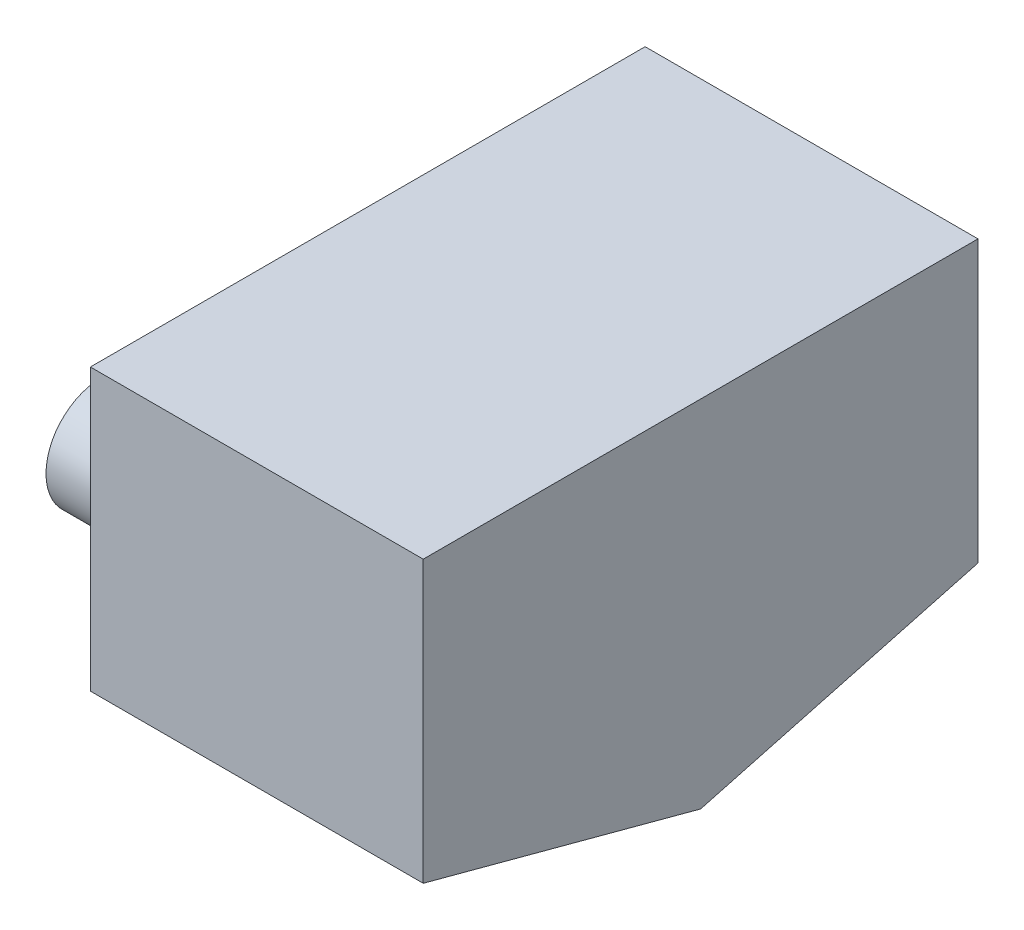
ISO-10303-21;
HEADER;
FILE_DESCRIPTION(('STEP AP214'),'2;1');
FILE_NAME('part.step','',(''),(''),'','','');
FILE_SCHEMA(('AUTOMOTIVE_DESIGN { 1 0 10303 214 1 1 1 1 }'));
ENDSEC;
DATA;
#1=APPLICATION_CONTEXT('core data for automotive mechanical design processes');
#2=APPLICATION_PROTOCOL_DEFINITION('international standard','automotive_design',2000,#1);
#3=PRODUCT_CONTEXT('',#1,'mechanical');
#4=PRODUCT('Part','Part','',(#3));
#5=PRODUCT_RELATED_PRODUCT_CATEGORY('part','',(#4));
#6=PRODUCT_DEFINITION_FORMATION('','',#4);
#7=PRODUCT_DEFINITION_CONTEXT('part definition',#1,'design');
#8=PRODUCT_DEFINITION('design','',#6,#7);
#9=PRODUCT_DEFINITION_SHAPE('','',#8);
#10=(LENGTH_UNIT() NAMED_UNIT(*) SI_UNIT(.MILLI.,.METRE.));
#11=(NAMED_UNIT(*) PLANE_ANGLE_UNIT() SI_UNIT($,.RADIAN.));
#12=(NAMED_UNIT(*) SI_UNIT($,.STERADIAN.) SOLID_ANGLE_UNIT());
#13=UNCERTAINTY_MEASURE_WITH_UNIT(LENGTH_MEASURE(1.E-05),#10,'distance_accuracy_value','');
#14=(GEOMETRIC_REPRESENTATION_CONTEXT(3) GLOBAL_UNCERTAINTY_ASSIGNED_CONTEXT((#13)) GLOBAL_UNIT_ASSIGNED_CONTEXT((#10,
#11,#12)) REPRESENTATION_CONTEXT('',''));
#15=CARTESIAN_POINT('',(0.,0.,0.));
#16=DIRECTION('',(0.,0.,1.));
#17=DIRECTION('',(1.,0.,0.));
#18=AXIS2_PLACEMENT_3D('',#15,#16,#17);
#19=CARTESIAN_POINT('',(0.,16.,25.));
#20=DIRECTION('',(1.,0.,0.));
#21=DIRECTION('',(0.,1.,0.));
#22=AXIS2_PLACEMENT_3D('',#19,#20,#21);
#23=PLANE('',#22);
#24=CARTESIAN_POINT('',(0.,7.83786374141146,5.5));
#25=DIRECTION('',(1.,0.,0.));
#26=DIRECTION('',(0.,1.,0.));
#27=AXIS2_PLACEMENT_3D('',#24,#25,#26);
#28=CIRCLE('',#27,2.5);
#29=CARTESIAN_POINT('',(0.,10.3378637414115,5.5));
#30=VERTEX_POINT('',#29);
#31=EDGE_CURVE('E104',#30,#30,#28,.F.);
#32=ORIENTED_EDGE('',*,*,#31,.F.);
#33=EDGE_LOOP('',(#32));
#34=FACE_BOUND('',#33,.T.);
#35=DIRECTION('',(0.,-1.,0.));
#36=VECTOR('',#35,1.);
#37=CARTESIAN_POINT('',(0.,16.,0.));
#38=LINE('',#37,#36);
#39=CARTESIAN_POINT('',(0.,16.,0.));
#40=VERTEX_POINT('',#39);
#41=CARTESIAN_POINT('',(0.,3.34936490538904,0.));
#42=VERTEX_POINT('',#41);
#43=EDGE_CURVE('E90',#40,#42,#38,.T.);
#44=ORIENTED_EDGE('',*,*,#43,.T.);
#45=DIRECTION('',(0.,0.258819045102518,-0.965925826289069));
#46=VECTOR('',#45,1.);
#47=CARTESIAN_POINT('',(0.,0.,12.5000000000002));
#48=LINE('',#47,#46);
#49=CARTESIAN_POINT('',(0.,0.,12.4999999999998));
#50=VERTEX_POINT('',#49);
#51=EDGE_CURVE('E11',#42,#50,#48,.F.);
#52=ORIENTED_EDGE('',*,*,#51,.T.);
#53=DIRECTION('',(0.,0.258819045102518,0.965925826289069));
#54=VECTOR('',#53,1.);
#55=CARTESIAN_POINT('',(0.,3.34936490538904,25.));
#56=LINE('',#55,#54);
#57=CARTESIAN_POINT('',(0.,3.34936490538904,25.));
#58=VERTEX_POINT('',#57);
#59=EDGE_CURVE('E120',#50,#58,#56,.T.);
#60=ORIENTED_EDGE('',*,*,#59,.T.);
#61=DIRECTION('',(0.,-1.,0.));
#62=VECTOR('',#61,1.);
#63=CARTESIAN_POINT('',(0.,16.,25.));
#64=LINE('',#63,#62);
#65=CARTESIAN_POINT('',(0.,16.,25.));
#66=VERTEX_POINT('',#65);
#67=EDGE_CURVE('E99',#66,#58,#64,.T.);
#68=ORIENTED_EDGE('',*,*,#67,.F.);
#69=DIRECTION('',(0.,0.,-1.));
#70=VECTOR('',#69,1.);
#71=CARTESIAN_POINT('',(0.,16.,25.));
#72=LINE('',#71,#70);
#73=EDGE_CURVE('E97',#66,#40,#72,.T.);
#74=ORIENTED_EDGE('',*,*,#73,.T.);
#75=EDGE_LOOP('',(#44,#52,#60,#68,#74));
#76=FACE_BOUND('',#75,.T.);
#77=CARTESIAN_POINT('',(0.,7.83786374141146,19.5));
#78=DIRECTION('',(1.,0.,0.));
#79=DIRECTION('',(0.,1.,0.));
#80=AXIS2_PLACEMENT_3D('',#77,#78,#79);
#81=CIRCLE('',#80,2.5);
#82=CARTESIAN_POINT('',(0.,10.3378637414115,19.5));
#83=VERTEX_POINT('',#82);
#84=EDGE_CURVE('E107',#83,#83,#81,.F.);
#85=ORIENTED_EDGE('',*,*,#84,.F.);
#86=EDGE_LOOP('',(#85));
#87=FACE_BOUND('',#86,.T.);
#88=ADVANCED_FACE('F35',(#34,#76,#87),#23,.F.);
#89=CARTESIAN_POINT('',(15.,16.,25.));
#90=DIRECTION('',(-1.,0.,0.));
#91=DIRECTION('',(0.,-1.,0.));
#92=AXIS2_PLACEMENT_3D('',#89,#90,#91);
#93=PLANE('',#92);
#94=DIRECTION('',(0.,-0.258819045102518,-0.965925826289069));
#95=VECTOR('',#94,1.);
#96=CARTESIAN_POINT('',(15.,3.34936490538904,25.));
#97=LINE('',#96,#95);
#98=CARTESIAN_POINT('',(15.,3.34936490538904,25.));
#99=VERTEX_POINT('',#98);
#100=CARTESIAN_POINT('',(15.,0.,12.4999999999998));
#101=VERTEX_POINT('',#100);
#102=EDGE_CURVE('E115',#99,#101,#97,.T.);
#103=ORIENTED_EDGE('',*,*,#102,.T.);
#104=DIRECTION('',(0.,-0.258819045102518,0.965925826289069));
#105=VECTOR('',#104,1.);
#106=CARTESIAN_POINT('',(15.,0.,12.5000000000002));
#107=LINE('',#106,#105);
#108=CARTESIAN_POINT('',(15.,3.34936490538904,0.));
#109=VERTEX_POINT('',#108);
#110=EDGE_CURVE('E57',#101,#109,#107,.F.);
#111=ORIENTED_EDGE('',*,*,#110,.T.);
#112=DIRECTION('',(0.,1.,0.));
#113=VECTOR('',#112,1.);
#114=CARTESIAN_POINT('',(15.,16.,0.));
#115=LINE('',#114,#113);
#116=CARTESIAN_POINT('',(15.,16.,0.));
#117=VERTEX_POINT('',#116);
#118=EDGE_CURVE('E102',#109,#117,#115,.T.);
#119=ORIENTED_EDGE('',*,*,#118,.T.);
#120=DIRECTION('',(0.,0.,-1.));
#121=VECTOR('',#120,1.);
#122=CARTESIAN_POINT('',(15.,16.,25.));
#123=LINE('',#122,#121);
#124=CARTESIAN_POINT('',(15.,16.,25.));
#125=VERTEX_POINT('',#124);
#126=EDGE_CURVE('E95',#125,#117,#123,.T.);
#127=ORIENTED_EDGE('',*,*,#126,.F.);
#128=DIRECTION('',(0.,1.,0.));
#129=VECTOR('',#128,1.);
#130=CARTESIAN_POINT('',(15.,16.,25.));
#131=LINE('',#130,#129);
#132=EDGE_CURVE('E81',#99,#125,#131,.T.);
#133=ORIENTED_EDGE('',*,*,#132,.F.);
#134=EDGE_LOOP('',(#103,#111,#119,#127,#133));
#135=FACE_BOUND('',#134,.T.);
#136=ADVANCED_FACE('F101',(#135),#93,.F.);
#137=CARTESIAN_POINT('',(15.,16.,25.));
#138=DIRECTION('',(0.,-1.,0.));
#139=DIRECTION('',(1.,0.,0.));
#140=AXIS2_PLACEMENT_3D('',#137,#138,#139);
#141=PLANE('',#140);
#142=DIRECTION('',(-1.,0.,0.));
#143=VECTOR('',#142,1.);
#144=CARTESIAN_POINT('',(15.,16.,0.));
#145=LINE('',#144,#143);
#146=EDGE_CURVE('E181',#117,#40,#145,.T.);
#147=ORIENTED_EDGE('',*,*,#146,.T.);
#148=ORIENTED_EDGE('',*,*,#73,.F.);
#149=DIRECTION('',(-1.,0.,0.));
#150=VECTOR('',#149,1.);
#151=CARTESIAN_POINT('',(15.,16.,25.));
#152=LINE('',#151,#150);
#153=EDGE_CURVE('E85',#125,#66,#152,.T.);
#154=ORIENTED_EDGE('',*,*,#153,.F.);
#155=ORIENTED_EDGE('',*,*,#126,.T.);
#156=EDGE_LOOP('',(#147,#148,#154,#155));
#157=FACE_BOUND('',#156,.T.);
#158=ADVANCED_FACE('F94',(#157),#141,.F.);
#159=CARTESIAN_POINT('',(15.,0.,25.));
#160=DIRECTION('',(0.,0.,1.));
#161=DIRECTION('',(1.,0.,0.));
#162=AXIS2_PLACEMENT_3D('',#159,#160,#161);
#163=PLANE('',#162);
#164=ORIENTED_EDGE('',*,*,#67,.T.);
#165=DIRECTION('',(1.,0.,0.));
#166=VECTOR('',#165,1.);
#167=CARTESIAN_POINT('',(15.,3.34936490538904,25.));
#168=LINE('',#167,#166);
#169=EDGE_CURVE('E88',#58,#99,#168,.T.);
#170=ORIENTED_EDGE('',*,*,#169,.T.);
#171=ORIENTED_EDGE('',*,*,#132,.T.);
#172=ORIENTED_EDGE('',*,*,#153,.T.);
#173=EDGE_LOOP('',(#164,#170,#171,#172));
#174=FACE_BOUND('',#173,.T.);
#175=ADVANCED_FACE('F84',(#174),#163,.T.);
#176=CARTESIAN_POINT('',(15.,0.,0.));
#177=DIRECTION('',(0.,0.,1.));
#178=DIRECTION('',(1.,0.,0.));
#179=AXIS2_PLACEMENT_3D('',#176,#177,#178);
#180=PLANE('',#179);
#181=ORIENTED_EDGE('',*,*,#118,.F.);
#182=DIRECTION('',(-1.,0.,0.));
#183=VECTOR('',#182,1.);
#184=CARTESIAN_POINT('',(15.,3.34936490538904,0.));
#185=LINE('',#184,#183);
#186=EDGE_CURVE('E43',#109,#42,#185,.T.);
#187=ORIENTED_EDGE('',*,*,#186,.T.);
#188=ORIENTED_EDGE('',*,*,#43,.F.);
#189=ORIENTED_EDGE('',*,*,#146,.F.);
#190=EDGE_LOOP('',(#181,#187,#188,#189));
#191=FACE_BOUND('',#190,.T.);
#192=ADVANCED_FACE('F146',(#191),#180,.F.);
#193=CARTESIAN_POINT('',(-5.,7.83786374141146,5.5));
#194=DIRECTION('',(1.,0.,0.));
#195=DIRECTION('',(0.,1.,0.));
#196=AXIS2_PLACEMENT_3D('',#193,#194,#195);
#197=CYLINDRICAL_SURFACE('',#196,2.5);
#198=CARTESIAN_POINT('',(-5.,7.83786374141146,5.5));
#199=DIRECTION('',(-1.,0.,0.));
#200=DIRECTION('',(0.,-1.,0.));
#201=AXIS2_PLACEMENT_3D('',#198,#199,#200);
#202=CIRCLE('',#201,2.5);
#203=CARTESIAN_POINT('',(-5.,5.33786374141146,5.5));
#204=VERTEX_POINT('',#203);
#205=EDGE_CURVE('E175',#204,#204,#202,.T.);
#206=ORIENTED_EDGE('',*,*,#205,.F.);
#207=EDGE_LOOP('',(#206));
#208=FACE_BOUND('',#207,.T.);
#209=ORIENTED_EDGE('',*,*,#31,.T.);
#210=EDGE_LOOP('',(#209));
#211=FACE_BOUND('',#210,.T.);
#212=ADVANCED_FACE('F155',(#208,#211),#197,.T.);
#213=CARTESIAN_POINT('',(-5.,7.83786374141146,5.5));
#214=DIRECTION('',(-1.,0.,0.));
#215=DIRECTION('',(0.,-1.,0.));
#216=AXIS2_PLACEMENT_3D('',#213,#214,#215);
#217=PLANE('',#216);
#218=ORIENTED_EDGE('',*,*,#205,.T.);
#219=EDGE_LOOP('',(#218));
#220=FACE_BOUND('',#219,.T.);
#221=ADVANCED_FACE('F159',(#220),#217,.T.);
#222=CARTESIAN_POINT('',(-5.,7.83786374141146,19.5));
#223=DIRECTION('',(1.,0.,0.));
#224=DIRECTION('',(0.,1.,0.));
#225=AXIS2_PLACEMENT_3D('',#222,#223,#224);
#226=CYLINDRICAL_SURFACE('',#225,2.5);
#227=CARTESIAN_POINT('',(-5.,7.83786374141146,19.5));
#228=DIRECTION('',(-1.,0.,0.));
#229=DIRECTION('',(0.,-1.,0.));
#230=AXIS2_PLACEMENT_3D('',#227,#228,#229);
#231=CIRCLE('',#230,2.5);
#232=CARTESIAN_POINT('',(-5.,5.33786374141147,19.5));
#233=VERTEX_POINT('',#232);
#234=EDGE_CURVE('E174',#233,#233,#231,.T.);
#235=ORIENTED_EDGE('',*,*,#234,.F.);
#236=EDGE_LOOP('',(#235));
#237=FACE_BOUND('',#236,.T.);
#238=ORIENTED_EDGE('',*,*,#84,.T.);
#239=EDGE_LOOP('',(#238));
#240=FACE_BOUND('',#239,.T.);
#241=ADVANCED_FACE('F163',(#237,#240),#226,.T.);
#242=CARTESIAN_POINT('',(-5.,7.83786374141146,19.5));
#243=DIRECTION('',(-1.,0.,0.));
#244=DIRECTION('',(0.,-1.,0.));
#245=AXIS2_PLACEMENT_3D('',#242,#243,#244);
#246=PLANE('',#245);
#247=ORIENTED_EDGE('',*,*,#234,.T.);
#248=EDGE_LOOP('',(#247));
#249=FACE_BOUND('',#248,.T.);
#250=ADVANCED_FACE('F135',(#249),#246,.T.);
#251=CARTESIAN_POINT('',(15.,3.34936490538904,25.));
#252=DIRECTION('',(0.,-0.965925826289069,0.258819045102518));
#253=DIRECTION('',(0.,-0.258819045102518,-0.965925826289069));
#254=AXIS2_PLACEMENT_3D('',#251,#252,#253);
#255=PLANE('',#254);
#256=ORIENTED_EDGE('',*,*,#59,.F.);
#257=DIRECTION('',(-1.,0.,0.));
#258=VECTOR('',#257,1.);
#259=CARTESIAN_POINT('',(0.,0.,12.4999999999998));
#260=LINE('',#259,#258);
#261=EDGE_CURVE('E117',#101,#50,#260,.T.);
#262=ORIENTED_EDGE('',*,*,#261,.F.);
#263=ORIENTED_EDGE('',*,*,#102,.F.);
#264=ORIENTED_EDGE('',*,*,#169,.F.);
#265=EDGE_LOOP('',(#256,#262,#263,#264));
#266=FACE_BOUND('',#265,.T.);
#267=ADVANCED_FACE('F129',(#266),#255,.T.);
#268=CARTESIAN_POINT('',(0.,0.,12.5000000000002));
#269=DIRECTION('',(0.,0.965925826289069,0.258819045102518));
#270=DIRECTION('',(0.,-0.258819045102518,0.965925826289069));
#271=AXIS2_PLACEMENT_3D('',#268,#269,#270);
#272=PLANE('',#271);
#273=ORIENTED_EDGE('',*,*,#51,.F.);
#274=ORIENTED_EDGE('',*,*,#186,.F.);
#275=ORIENTED_EDGE('',*,*,#110,.F.);
#276=ORIENTED_EDGE('',*,*,#261,.T.);
#277=EDGE_LOOP('',(#273,#274,#275,#276));
#278=FACE_BOUND('',#277,.T.);
#279=ADVANCED_FACE('F37',(#278),#272,.F.);
#280=CLOSED_SHELL('',(#88,#136,#158,#175,#192,#212,#221,#241,#250,#267,#279));
#281=MANIFOLD_SOLID_BREP('B2',#280);
#282=ADVANCED_BREP_SHAPE_REPRESENTATION('',(#18,#281),#14);
#283=SHAPE_DEFINITION_REPRESENTATION(#9,#282);
ENDSEC;
END-ISO-10303-21;
